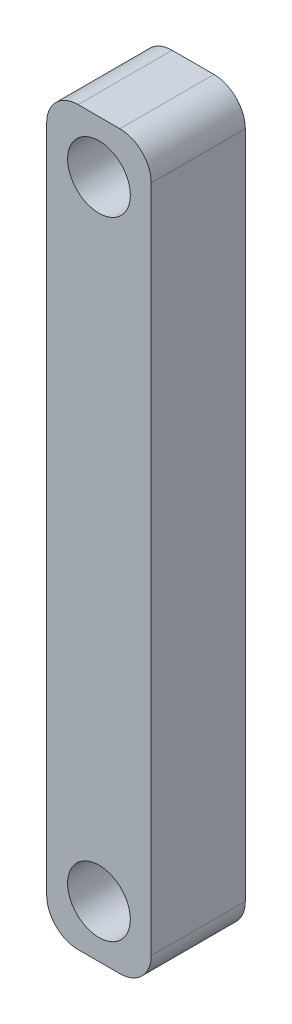
ISO-10303-21;
HEADER;
FILE_DESCRIPTION(('STEP AP214'),'2;1');
FILE_NAME('part.step','',(''),(''),'','','');
FILE_SCHEMA(('AUTOMOTIVE_DESIGN { 1 0 10303 214 1 1 1 1 }'));
ENDSEC;
DATA;
#1=APPLICATION_CONTEXT('core data for automotive mechanical design processes');
#2=APPLICATION_PROTOCOL_DEFINITION('international standard','automotive_design',2000,#1);
#3=PRODUCT_CONTEXT('',#1,'mechanical');
#4=PRODUCT('Part','Part','',(#3));
#5=PRODUCT_RELATED_PRODUCT_CATEGORY('part','',(#4));
#6=PRODUCT_DEFINITION_FORMATION('','',#4);
#7=PRODUCT_DEFINITION_CONTEXT('part definition',#1,'design');
#8=PRODUCT_DEFINITION('design','',#6,#7);
#9=PRODUCT_DEFINITION_SHAPE('','',#8);
#10=(LENGTH_UNIT() NAMED_UNIT(*) SI_UNIT(.MILLI.,.METRE.));
#11=(NAMED_UNIT(*) PLANE_ANGLE_UNIT() SI_UNIT($,.RADIAN.));
#12=(NAMED_UNIT(*) SI_UNIT($,.STERADIAN.) SOLID_ANGLE_UNIT());
#13=UNCERTAINTY_MEASURE_WITH_UNIT(LENGTH_MEASURE(1.E-05),#10,'distance_accuracy_value','');
#14=(GEOMETRIC_REPRESENTATION_CONTEXT(3) GLOBAL_UNCERTAINTY_ASSIGNED_CONTEXT((#13)) GLOBAL_UNIT_ASSIGNED_CONTEXT((#10,
#11,#12)) REPRESENTATION_CONTEXT('',''));
#15=CARTESIAN_POINT('',(0.,0.,0.));
#16=DIRECTION('',(0.,0.,1.));
#17=DIRECTION('',(1.,0.,0.));
#18=AXIS2_PLACEMENT_3D('',#15,#16,#17);
#19=CARTESIAN_POINT('',(-20.5496626180832,69.7557354925773,22.86));
#20=DIRECTION('',(1.,0.,0.));
#21=DIRECTION('',(0.,0.,-0.999999999999999));
#22=AXIS2_PLACEMENT_3D('',#19,#20,#21);
#23=PLANE('',#22);
#24=DIRECTION('',(0.,-1.,0.));
#25=VECTOR('',#24,1.);
#26=CARTESIAN_POINT('',(-20.5496626180832,69.7557354925773,22.86));
#27=LINE('',#26,#25);
#28=CARTESIAN_POINT('',(-20.5496626180836,62.1357354925776,22.86));
#29=VERTEX_POINT('',#28);
#30=CARTESIAN_POINT('',(-20.5496626180834,-100.424264507422,22.86));
#31=VERTEX_POINT('',#30);
#32=EDGE_CURVE('E118',#29,#31,#27,.T.);
#33=ORIENTED_EDGE('',*,*,#32,.F.);
#34=DIRECTION('',(0.,0.,-0.999999999999999));
#35=VECTOR('',#34,1.);
#36=CARTESIAN_POINT('',(-20.5496626180836,62.1357354925776,22.86));
#37=LINE('',#36,#35);
#38=CARTESIAN_POINT('',(-20.5496626180836,62.1357354925776,0.));
#39=VERTEX_POINT('',#38);
#40=EDGE_CURVE('E103',#29,#39,#37,.T.);
#41=ORIENTED_EDGE('',*,*,#40,.T.);
#42=DIRECTION('',(0.,-1.,0.));
#43=VECTOR('',#42,1.);
#44=CARTESIAN_POINT('',(-20.5496626180832,69.7557354925773,0.));
#45=LINE('',#44,#43);
#46=CARTESIAN_POINT('',(-20.5496626180831,-100.424264507423,0.));
#47=VERTEX_POINT('',#46);
#48=EDGE_CURVE('E115',#39,#47,#45,.T.);
#49=ORIENTED_EDGE('',*,*,#48,.T.);
#50=DIRECTION('',(0.,0.,-0.999999999999999));
#51=VECTOR('',#50,1.);
#52=CARTESIAN_POINT('',(-20.5496626180834,-100.424264507422,22.86));
#53=LINE('',#52,#51);
#54=EDGE_CURVE('E120',#47,#31,#53,.F.);
#55=ORIENTED_EDGE('',*,*,#54,.T.);
#56=EDGE_LOOP('',(#33,#41,#49,#55));
#57=FACE_BOUND('',#56,.T.);
#58=ADVANCED_FACE('F32',(#57),#23,.F.);
#59=CARTESIAN_POINT('',(-20.5496626180834,-108.044264507422,22.86));
#60=DIRECTION('',(0.,1.,0.));
#61=DIRECTION('',(0.,0.,0.999999999999999));
#62=AXIS2_PLACEMENT_3D('',#59,#60,#61);
#63=PLANE('',#62);
#64=DIRECTION('',(1.,0.,0.));
#65=VECTOR('',#64,1.);
#66=CARTESIAN_POINT('',(-20.5496626180834,-108.044264507422,22.86));
#67=LINE('',#66,#65);
#68=CARTESIAN_POINT('',(-12.9296626180835,-108.044264507422,22.86));
#69=VERTEX_POINT('',#68);
#70=CARTESIAN_POINT('',(-2.76966261808331,-108.044264507422,22.86));
#71=VERTEX_POINT('',#70);
#72=EDGE_CURVE('E166',#69,#71,#67,.T.);
#73=ORIENTED_EDGE('',*,*,#72,.F.);
#74=DIRECTION('',(0.,0.,-0.999999999999999));
#75=VECTOR('',#74,1.);
#76=CARTESIAN_POINT('',(-12.9296626180835,-108.044264507422,22.86));
#77=LINE('',#76,#75);
#78=CARTESIAN_POINT('',(-12.9296626180835,-108.044264507422,0.));
#79=VERTEX_POINT('',#78);
#80=EDGE_CURVE('E11',#69,#79,#77,.T.);
#81=ORIENTED_EDGE('',*,*,#80,.T.);
#82=DIRECTION('',(1.,0.,0.));
#83=VECTOR('',#82,1.);
#84=CARTESIAN_POINT('',(-20.5496626180834,-108.044264507422,0.));
#85=LINE('',#84,#83);
#86=CARTESIAN_POINT('',(-2.76966261808331,-108.044264507422,0.));
#87=VERTEX_POINT('',#86);
#88=EDGE_CURVE('E125',#79,#87,#85,.T.);
#89=ORIENTED_EDGE('',*,*,#88,.T.);
#90=DIRECTION('',(0.,0.,-0.999999999999999));
#91=VECTOR('',#90,1.);
#92=CARTESIAN_POINT('',(-2.76966261808331,-108.044264507422,22.86));
#93=LINE('',#92,#91);
#94=EDGE_CURVE('E40',#87,#71,#93,.F.);
#95=ORIENTED_EDGE('',*,*,#94,.T.);
#96=EDGE_LOOP('',(#73,#81,#89,#95));
#97=FACE_BOUND('',#96,.T.);
#98=ADVANCED_FACE('F165',(#97),#63,.F.);
#99=CARTESIAN_POINT('',(4.85033738191665,69.7557354925771,22.86));
#100=DIRECTION('',(-1.,0.,0.));
#101=DIRECTION('',(0.,-1.,0.));
#102=AXIS2_PLACEMENT_3D('',#99,#100,#101);
#103=PLANE('',#102);
#104=DIRECTION('',(0.,1.,0.));
#105=VECTOR('',#104,1.);
#106=CARTESIAN_POINT('',(4.85033738191665,69.7557354925771,0.));
#107=LINE('',#106,#105);
#108=CARTESIAN_POINT('',(4.85033738191643,-100.424264507422,0.));
#109=VERTEX_POINT('',#108);
#110=CARTESIAN_POINT('',(4.85033738191643,62.1357354925776,0.));
#111=VERTEX_POINT('',#110);
#112=EDGE_CURVE('E129',#109,#111,#107,.T.);
#113=ORIENTED_EDGE('',*,*,#112,.T.);
#114=DIRECTION('',(0.,0.,-0.999999999999999));
#115=VECTOR('',#114,1.);
#116=CARTESIAN_POINT('',(4.85033738191643,62.1357354925776,22.86));
#117=LINE('',#116,#115);
#118=CARTESIAN_POINT('',(4.85033738191643,62.1357354925776,22.86));
#119=VERTEX_POINT('',#118);
#120=EDGE_CURVE('E47',#111,#119,#117,.F.);
#121=ORIENTED_EDGE('',*,*,#120,.T.);
#122=DIRECTION('',(0.,1.,0.));
#123=VECTOR('',#122,1.);
#124=CARTESIAN_POINT('',(4.85033738191665,69.7557354925771,22.86));
#125=LINE('',#124,#123);
#126=CARTESIAN_POINT('',(4.85033738191643,-100.424264507422,22.86));
#127=VERTEX_POINT('',#126);
#128=EDGE_CURVE('E172',#127,#119,#125,.T.);
#129=ORIENTED_EDGE('',*,*,#128,.F.);
#130=DIRECTION('',(0.,0.,-0.999999999999999));
#131=VECTOR('',#130,1.);
#132=CARTESIAN_POINT('',(4.85033738191643,-100.424264507422,22.86));
#133=LINE('',#132,#131);
#134=EDGE_CURVE('E159',#127,#109,#133,.T.);
#135=ORIENTED_EDGE('',*,*,#134,.T.);
#136=EDGE_LOOP('',(#113,#121,#129,#135));
#137=FACE_BOUND('',#136,.T.);
#138=ADVANCED_FACE('F176',(#137),#103,.F.);
#139=CARTESIAN_POINT('',(-20.5496626180832,69.7557354925773,22.86));
#140=DIRECTION('',(0.,-1.,0.));
#141=DIRECTION('',(0.,0.,-0.999999999999999));
#142=AXIS2_PLACEMENT_3D('',#139,#140,#141);
#143=PLANE('',#142);
#144=DIRECTION('',(-1.,0.,0.));
#145=VECTOR('',#144,1.);
#146=CARTESIAN_POINT('',(-20.5496626180832,69.7557354925773,0.));
#147=LINE('',#146,#145);
#148=CARTESIAN_POINT('',(-2.76966261808353,69.7557354925774,0.));
#149=VERTEX_POINT('',#148);
#150=CARTESIAN_POINT('',(-12.9296626180835,69.7557354925773,0.));
#151=VERTEX_POINT('',#150);
#152=EDGE_CURVE('E139',#149,#151,#147,.T.);
#153=ORIENTED_EDGE('',*,*,#152,.T.);
#154=DIRECTION('',(0.,0.,-0.999999999999999));
#155=VECTOR('',#154,1.);
#156=CARTESIAN_POINT('',(-12.9296626180835,69.7557354925773,22.86));
#157=LINE('',#156,#155);
#158=CARTESIAN_POINT('',(-12.9296626180835,69.7557354925773,22.86));
#159=VERTEX_POINT('',#158);
#160=EDGE_CURVE('E104',#151,#159,#157,.F.);
#161=ORIENTED_EDGE('',*,*,#160,.T.);
#162=DIRECTION('',(-1.,0.,0.));
#163=VECTOR('',#162,1.);
#164=CARTESIAN_POINT('',(-20.5496626180832,69.7557354925773,22.86));
#165=LINE('',#164,#163);
#166=CARTESIAN_POINT('',(-2.76966261808353,69.7557354925774,22.86));
#167=VERTEX_POINT('',#166);
#168=EDGE_CURVE('E135',#167,#159,#165,.T.);
#169=ORIENTED_EDGE('',*,*,#168,.F.);
#170=DIRECTION('',(0.,0.,-0.999999999999999));
#171=VECTOR('',#170,1.);
#172=CARTESIAN_POINT('',(-2.76966261808353,69.7557354925774,22.86));
#173=LINE('',#172,#171);
#174=EDGE_CURVE('E109',#167,#149,#173,.T.);
#175=ORIENTED_EDGE('',*,*,#174,.T.);
#176=EDGE_LOOP('',(#153,#161,#169,#175));
#177=FACE_BOUND('',#176,.T.);
#178=ADVANCED_FACE('F183',(#177),#143,.F.);
#179=CARTESIAN_POINT('',(-20.5496626180834,-108.044264507422,22.86));
#180=DIRECTION('',(0.,0.,0.999999999999999));
#181=DIRECTION('',(1.,0.,0.));
#182=AXIS2_PLACEMENT_3D('',#179,#180,#181);
#183=PLANE('',#182);
#184=CARTESIAN_POINT('',(-7.84966261808362,57.0557354925775,22.86));
#185=DIRECTION('',(0.,0.,0.999999999999999));
#186=DIRECTION('',(1.,0.,0.));
#187=AXIS2_PLACEMENT_3D('',#184,#185,#186);
#188=CIRCLE('',#187,7.62);
#189=CARTESIAN_POINT('',(-0.229662618083513,57.0557354925774,22.86));
#190=VERTEX_POINT('',#189);
#191=EDGE_CURVE('E144',#190,#190,#188,.T.);
#192=ORIENTED_EDGE('',*,*,#191,.F.);
#193=EDGE_LOOP('',(#192));
#194=FACE_BOUND('',#193,.T.);
#195=CARTESIAN_POINT('',(-7.84966261808329,-95.3442645074225,22.86));
#196=DIRECTION('',(0.,0.,0.999999999999999));
#197=DIRECTION('',(1.,0.,0.));
#198=AXIS2_PLACEMENT_3D('',#195,#196,#197);
#199=CIRCLE('',#198,7.62);
#200=CARTESIAN_POINT('',(-0.229662618083291,-95.3442645074225,22.86));
#201=VERTEX_POINT('',#200);
#202=EDGE_CURVE('E132',#201,#201,#199,.T.);
#203=ORIENTED_EDGE('',*,*,#202,.F.);
#204=EDGE_LOOP('',(#203));
#205=FACE_BOUND('',#204,.T.);
#206=ORIENTED_EDGE('',*,*,#168,.T.);
#207=CARTESIAN_POINT('',(-12.9296626180836,62.1357354925774,22.86));
#208=DIRECTION('',(0.,0.,0.999999999999999));
#209=DIRECTION('',(1.,0.,0.));
#210=AXIS2_PLACEMENT_3D('',#207,#208,#209);
#211=CIRCLE('',#210,7.62);
#212=EDGE_CURVE('E157',#159,#29,#211,.T.);
#213=ORIENTED_EDGE('',*,*,#212,.T.);
#214=ORIENTED_EDGE('',*,*,#32,.T.);
#215=CARTESIAN_POINT('',(-12.9296626180835,-100.424264507422,22.86));
#216=DIRECTION('',(0.,0.,0.999999999999999));
#217=DIRECTION('',(1.,0.,0.));
#218=AXIS2_PLACEMENT_3D('',#215,#216,#217);
#219=CIRCLE('',#218,7.62);
#220=EDGE_CURVE('E153',#31,#69,#219,.T.);
#221=ORIENTED_EDGE('',*,*,#220,.T.);
#222=ORIENTED_EDGE('',*,*,#72,.T.);
#223=CARTESIAN_POINT('',(-2.76966261808331,-100.424264507422,22.86));
#224=DIRECTION('',(0.,0.,0.999999999999999));
#225=DIRECTION('',(1.,0.,0.));
#226=AXIS2_PLACEMENT_3D('',#223,#224,#225);
#227=CIRCLE('',#226,7.62);
#228=EDGE_CURVE('E54',#71,#127,#227,.T.);
#229=ORIENTED_EDGE('',*,*,#228,.T.);
#230=ORIENTED_EDGE('',*,*,#128,.T.);
#231=CARTESIAN_POINT('',(-2.76966261808331,62.1357354925772,22.86));
#232=DIRECTION('',(0.,0.,0.999999999999999));
#233=DIRECTION('',(1.,0.,0.));
#234=AXIS2_PLACEMENT_3D('',#231,#232,#233);
#235=CIRCLE('',#234,7.62);
#236=EDGE_CURVE('E155',#119,#167,#235,.T.);
#237=ORIENTED_EDGE('',*,*,#236,.T.);
#238=EDGE_LOOP('',(#206,#213,#214,#221,#222,#229,#230,#237));
#239=FACE_BOUND('',#238,.T.);
#240=ADVANCED_FACE('F170',(#194,#205,#239),#183,.T.);
#241=CARTESIAN_POINT('',(-20.5496626180834,-108.044264507422,0.));
#242=DIRECTION('',(0.,0.,0.999999999999999));
#243=DIRECTION('',(1.,0.,0.));
#244=AXIS2_PLACEMENT_3D('',#241,#242,#243);
#245=PLANE('',#244);
#246=CARTESIAN_POINT('',(-7.84966261808362,57.0557354925775,0.));
#247=DIRECTION('',(0.,0.,0.999999999999999));
#248=DIRECTION('',(1.,0.,0.));
#249=AXIS2_PLACEMENT_3D('',#246,#247,#248);
#250=CIRCLE('',#249,7.62);
#251=CARTESIAN_POINT('',(-0.229662618083513,57.0557354925774,0.));
#252=VERTEX_POINT('',#251);
#253=EDGE_CURVE('E141',#252,#252,#250,.T.);
#254=ORIENTED_EDGE('',*,*,#253,.T.);
#255=EDGE_LOOP('',(#254));
#256=FACE_BOUND('',#255,.T.);
#257=CARTESIAN_POINT('',(-7.84966261808329,-95.3442645074225,0.));
#258=DIRECTION('',(0.,0.,0.999999999999999));
#259=DIRECTION('',(1.,0.,0.));
#260=AXIS2_PLACEMENT_3D('',#257,#258,#259);
#261=CIRCLE('',#260,7.62);
#262=CARTESIAN_POINT('',(-0.229662618083291,-95.3442645074225,0.));
#263=VERTEX_POINT('',#262);
#264=EDGE_CURVE('E126',#263,#263,#261,.T.);
#265=ORIENTED_EDGE('',*,*,#264,.T.);
#266=EDGE_LOOP('',(#265));
#267=FACE_BOUND('',#266,.T.);
#268=ORIENTED_EDGE('',*,*,#48,.F.);
#269=CARTESIAN_POINT('',(-12.9296626180836,62.1357354925774,0.));
#270=DIRECTION('',(0.,0.,0.999999999999999));
#271=DIRECTION('',(1.,0.,0.));
#272=AXIS2_PLACEMENT_3D('',#269,#270,#271);
#273=CIRCLE('',#272,7.62);
#274=EDGE_CURVE('E99',#39,#151,#273,.F.);
#275=ORIENTED_EDGE('',*,*,#274,.T.);
#276=ORIENTED_EDGE('',*,*,#152,.F.);
#277=CARTESIAN_POINT('',(-2.76966261808331,62.1357354925772,0.));
#278=DIRECTION('',(0.,0.,0.999999999999999));
#279=DIRECTION('',(1.,0.,0.));
#280=AXIS2_PLACEMENT_3D('',#277,#278,#279);
#281=CIRCLE('',#280,7.62);
#282=EDGE_CURVE('E110',#149,#111,#281,.F.);
#283=ORIENTED_EDGE('',*,*,#282,.T.);
#284=ORIENTED_EDGE('',*,*,#112,.F.);
#285=CARTESIAN_POINT('',(-2.76966261808331,-100.424264507422,0.));
#286=DIRECTION('',(0.,0.,0.999999999999999));
#287=DIRECTION('',(1.,0.,0.));
#288=AXIS2_PLACEMENT_3D('',#285,#286,#287);
#289=CIRCLE('',#288,7.62);
#290=EDGE_CURVE('E119',#109,#87,#289,.F.);
#291=ORIENTED_EDGE('',*,*,#290,.T.);
#292=ORIENTED_EDGE('',*,*,#88,.F.);
#293=CARTESIAN_POINT('',(-12.9296626180835,-100.424264507422,0.));
#294=DIRECTION('',(0.,0.,0.999999999999999));
#295=DIRECTION('',(1.,0.,0.));
#296=AXIS2_PLACEMENT_3D('',#293,#294,#295);
#297=CIRCLE('',#296,7.62);
#298=EDGE_CURVE('E124',#79,#47,#297,.F.);
#299=ORIENTED_EDGE('',*,*,#298,.T.);
#300=EDGE_LOOP('',(#268,#275,#276,#283,#284,#291,#292,#299));
#301=FACE_BOUND('',#300,.T.);
#302=ADVANCED_FACE('F122',(#256,#267,#301),#245,.F.);
#303=CARTESIAN_POINT('',(-7.84966261808329,-95.3442645074225,-55.8799999999999));
#304=DIRECTION('',(0.,0.,0.999999999999999));
#305=DIRECTION('',(1.,0.,0.));
#306=AXIS2_PLACEMENT_3D('',#303,#304,#305);
#307=CYLINDRICAL_SURFACE('',#306,7.62);
#308=CARTESIAN_POINT('',(-0.229662618083291,-95.3442645074225,22.86));
#309=CARTESIAN_POINT('',(-0.229662618083291,-95.3442645074225,22.621875));
#310=CARTESIAN_POINT('',(-0.229662618083291,-95.3442645074225,22.38375));
#311=CARTESIAN_POINT('',(-0.229662618083291,-95.3442645074225,21.9075));
#312=CARTESIAN_POINT('',(-0.229662618083291,-95.3442645074225,21.669375));
#313=CARTESIAN_POINT('',(-0.229662618083291,-95.3442645074225,21.193125));
#314=CARTESIAN_POINT('',(-0.229662618083291,-95.3442645074225,20.955));
#315=CARTESIAN_POINT('',(-0.229662618083291,-95.3442645074225,20.47875));
#316=CARTESIAN_POINT('',(-0.229662618083291,-95.3442645074225,20.240625));
#317=CARTESIAN_POINT('',(-0.229662618083291,-95.3442645074225,19.764375));
#318=CARTESIAN_POINT('',(-0.229662618083291,-95.3442645074225,19.52625));
#319=CARTESIAN_POINT('',(-0.229662618083291,-95.3442645074225,19.05));
#320=CARTESIAN_POINT('',(-0.229662618083291,-95.3442645074225,18.811875));
#321=CARTESIAN_POINT('',(-0.229662618083291,-95.3442645074225,18.335625));
#322=CARTESIAN_POINT('',(-0.229662618083291,-95.3442645074225,18.0975));
#323=CARTESIAN_POINT('',(-0.229662618083291,-95.3442645074225,17.62125));
#324=CARTESIAN_POINT('',(-0.229662618083291,-95.3442645074225,17.383125));
#325=CARTESIAN_POINT('',(-0.229662618083291,-95.3442645074225,16.906875));
#326=CARTESIAN_POINT('',(-0.229662618083291,-95.3442645074225,16.66875));
#327=CARTESIAN_POINT('',(-0.229662618083291,-95.3442645074225,16.1925));
#328=CARTESIAN_POINT('',(-0.229662618083291,-95.3442645074225,15.954375));
#329=CARTESIAN_POINT('',(-0.229662618083291,-95.3442645074225,15.478125));
#330=CARTESIAN_POINT('',(-0.229662618083291,-95.3442645074225,15.24));
#331=CARTESIAN_POINT('',(-0.229662618083291,-95.3442645074225,14.76375));
#332=CARTESIAN_POINT('',(-0.229662618083291,-95.3442645074225,14.525625));
#333=CARTESIAN_POINT('',(-0.229662618083291,-95.3442645074225,14.049375));
#334=CARTESIAN_POINT('',(-0.229662618083291,-95.3442645074225,13.81125));
#335=CARTESIAN_POINT('',(-0.229662618083291,-95.3442645074225,13.335));
#336=CARTESIAN_POINT('',(-0.229662618083291,-95.3442645074225,13.096875));
#337=CARTESIAN_POINT('',(-0.229662618083291,-95.3442645074225,12.620625));
#338=CARTESIAN_POINT('',(-0.229662618083291,-95.3442645074225,12.3825));
#339=CARTESIAN_POINT('',(-0.229662618083291,-95.3442645074225,11.90625));
#340=CARTESIAN_POINT('',(-0.229662618083291,-95.3442645074225,11.668125));
#341=CARTESIAN_POINT('',(-0.229662618083291,-95.3442645074225,11.191875));
#342=CARTESIAN_POINT('',(-0.229662618083291,-95.3442645074225,10.95375));
#343=CARTESIAN_POINT('',(-0.229662618083291,-95.3442645074225,10.4775));
#344=CARTESIAN_POINT('',(-0.229662618083291,-95.3442645074225,10.239375));
#345=CARTESIAN_POINT('',(-0.229662618083291,-95.3442645074225,9.76312499999999));
#346=CARTESIAN_POINT('',(-0.229662618083291,-95.3442645074225,9.52499999999999));
#347=CARTESIAN_POINT('',(-0.229662618083291,-95.3442645074225,9.04874999999999));
#348=CARTESIAN_POINT('',(-0.229662618083291,-95.3442645074225,8.81062499999998));
#349=CARTESIAN_POINT('',(-0.229662618083291,-95.3442645074225,8.33437499999999));
#350=CARTESIAN_POINT('',(-0.229662618083291,-95.3442645074225,8.09624999999999));
#351=CARTESIAN_POINT('',(-0.229662618083291,-95.3442645074225,7.61999999999999));
#352=CARTESIAN_POINT('',(-0.229662618083291,-95.3442645074225,7.38187499999999));
#353=CARTESIAN_POINT('',(-0.229662618083291,-95.3442645074225,6.90562499999999));
#354=CARTESIAN_POINT('',(-0.229662618083291,-95.3442645074225,6.66749999999999));
#355=CARTESIAN_POINT('',(-0.229662618083291,-95.3442645074225,6.19124999999999));
#356=CARTESIAN_POINT('',(-0.229662618083291,-95.3442645074225,5.95312499999998));
#357=CARTESIAN_POINT('',(-0.229662618083291,-95.3442645074225,5.47687499999998));
#358=CARTESIAN_POINT('',(-0.229662618083291,-95.3442645074225,5.23874999999998));
#359=CARTESIAN_POINT('',(-0.229662618083291,-95.3442645074225,4.76249999999998));
#360=CARTESIAN_POINT('',(-0.229662618083291,-95.3442645074225,4.52437499999998));
#361=CARTESIAN_POINT('',(-0.229662618083291,-95.3442645074225,4.04812499999998));
#362=CARTESIAN_POINT('',(-0.229662618083291,-95.3442645074225,3.80999999999998));
#363=CARTESIAN_POINT('',(-0.229662618083291,-95.3442645074225,3.33374999999999));
#364=CARTESIAN_POINT('',(-0.229662618083291,-95.3442645074225,3.09562499999999));
#365=CARTESIAN_POINT('',(-0.229662618083291,-95.3442645074225,2.61937499999998));
#366=CARTESIAN_POINT('',(-0.229662618083291,-95.3442645074225,2.38124999999998));
#367=CARTESIAN_POINT('',(-0.229662618083291,-95.3442645074225,1.90499999999998));
#368=CARTESIAN_POINT('',(-0.229662618083291,-95.3442645074225,1.66687499999998));
#369=CARTESIAN_POINT('',(-0.229662618083291,-95.3442645074225,1.19062499999998));
#370=CARTESIAN_POINT('',(-0.229662618083291,-95.3442645074225,0.952499999999983));
#371=CARTESIAN_POINT('',(-0.229662618083291,-95.3442645074225,0.476249999999981));
#372=CARTESIAN_POINT('',(-0.229662618083291,-95.3442645074225,0.23812499999998));
#373=CARTESIAN_POINT('',(-0.229662618083291,-95.3442645074225,0.));
#374=B_SPLINE_CURVE_WITH_KNOTS('',3,(#308,#309,#310,#311,#312,#313,#314,#315,#316,#317,#318,
#319,#320,#321,#322,#323,#324,#325,#326,#327,#328,#329,#330,#331,#332,#333,#334,#335,#336,#337,
#338,#339,#340,#341,#342,#343,#344,#345,#346,#347,#348,#349,#350,#351,#352,#353,#354,#355,#356,
#357,#358,#359,#360,#361,#362,#363,#364,#365,#366,#367,#368,#369,#370,#371,#372,#373),
.UNSPECIFIED.,.F.,.F.,(4,2,2,2,2,2,2,2,2,2,2,2,2,2,2,2,2,2,2,2,2,2,2,2,2,2,2,2,2,2,2,2,4),(0.,
0.714374999999989,1.42874999999999,2.143125,2.8575,3.57187499999999,4.28624999999999,
5.00062499999999,5.715,6.429375,7.14375,7.85812500000001,8.5725,9.286875,10.00125,10.715625,
11.43,12.144375,12.85875,13.573125,14.2875,15.001875,15.71625,16.430625,17.145,17.859375,
18.57375,19.288125,20.0025,20.716875,21.43125,22.145625,22.86),.UNSPECIFIED.);
#375=EDGE_CURVE('BSEAM199',#201,#263,#374,.T.);
#376=ORIENTED_EDGE('',*,*,#202,.T.);
#377=ORIENTED_EDGE('',*,*,#264,.F.);
#378=ORIENTED_EDGE('',*,*,#375,.T.);
#379=ORIENTED_EDGE('',*,*,#375,.F.);
#380=EDGE_LOOP('',(#376,#378,#377,#379));
#381=FACE_BOUND('',#380,.T.);
#382=ADVANCED_FACE('F199',(#381),#307,.F.);
#383=CARTESIAN_POINT('',(-7.84966261808351,57.0557354925774,-55.8799999999999));
#384=DIRECTION('',(0.,0.,0.999999999999999));
#385=DIRECTION('',(1.,0.,0.));
#386=AXIS2_PLACEMENT_3D('',#383,#384,#385);
#387=CYLINDRICAL_SURFACE('',#386,7.62);
#388=CARTESIAN_POINT('',(-0.229662618083513,57.0557354925774,22.86));
#389=CARTESIAN_POINT('',(-0.229662618083513,57.0557354925774,22.621875));
#390=CARTESIAN_POINT('',(-0.229662618083513,57.0557354925774,22.38375));
#391=CARTESIAN_POINT('',(-0.229662618083513,57.0557354925774,21.9075));
#392=CARTESIAN_POINT('',(-0.229662618083513,57.0557354925774,21.669375));
#393=CARTESIAN_POINT('',(-0.229662618083513,57.0557354925774,21.193125));
#394=CARTESIAN_POINT('',(-0.229662618083513,57.0557354925774,20.955));
#395=CARTESIAN_POINT('',(-0.229662618083513,57.0557354925774,20.47875));
#396=CARTESIAN_POINT('',(-0.229662618083513,57.0557354925774,20.240625));
#397=CARTESIAN_POINT('',(-0.229662618083513,57.0557354925774,19.764375));
#398=CARTESIAN_POINT('',(-0.229662618083513,57.0557354925774,19.52625));
#399=CARTESIAN_POINT('',(-0.229662618083513,57.0557354925774,19.05));
#400=CARTESIAN_POINT('',(-0.229662618083513,57.0557354925774,18.811875));
#401=CARTESIAN_POINT('',(-0.229662618083513,57.0557354925774,18.335625));
#402=CARTESIAN_POINT('',(-0.229662618083513,57.0557354925774,18.0975));
#403=CARTESIAN_POINT('',(-0.229662618083513,57.0557354925774,17.62125));
#404=CARTESIAN_POINT('',(-0.229662618083513,57.0557354925774,17.383125));
#405=CARTESIAN_POINT('',(-0.229662618083513,57.0557354925774,16.906875));
#406=CARTESIAN_POINT('',(-0.229662618083513,57.0557354925774,16.66875));
#407=CARTESIAN_POINT('',(-0.229662618083513,57.0557354925774,16.1925));
#408=CARTESIAN_POINT('',(-0.229662618083513,57.0557354925774,15.954375));
#409=CARTESIAN_POINT('',(-0.229662618083513,57.0557354925774,15.478125));
#410=CARTESIAN_POINT('',(-0.229662618083513,57.0557354925774,15.24));
#411=CARTESIAN_POINT('',(-0.229662618083513,57.0557354925774,14.76375));
#412=CARTESIAN_POINT('',(-0.229662618083513,57.0557354925774,14.525625));
#413=CARTESIAN_POINT('',(-0.229662618083513,57.0557354925774,14.049375));
#414=CARTESIAN_POINT('',(-0.229662618083513,57.0557354925774,13.81125));
#415=CARTESIAN_POINT('',(-0.229662618083513,57.0557354925774,13.335));
#416=CARTESIAN_POINT('',(-0.229662618083513,57.0557354925774,13.096875));
#417=CARTESIAN_POINT('',(-0.229662618083513,57.0557354925774,12.620625));
#418=CARTESIAN_POINT('',(-0.229662618083513,57.0557354925774,12.3825));
#419=CARTESIAN_POINT('',(-0.229662618083513,57.0557354925774,11.90625));
#420=CARTESIAN_POINT('',(-0.229662618083513,57.0557354925774,11.668125));
#421=CARTESIAN_POINT('',(-0.229662618083513,57.0557354925774,11.191875));
#422=CARTESIAN_POINT('',(-0.229662618083513,57.0557354925774,10.95375));
#423=CARTESIAN_POINT('',(-0.229662618083513,57.0557354925774,10.4775));
#424=CARTESIAN_POINT('',(-0.229662618083513,57.0557354925774,10.239375));
#425=CARTESIAN_POINT('',(-0.229662618083513,57.0557354925774,9.76312499999999));
#426=CARTESIAN_POINT('',(-0.229662618083513,57.0557354925774,9.52499999999999));
#427=CARTESIAN_POINT('',(-0.229662618083513,57.0557354925774,9.04874999999999));
#428=CARTESIAN_POINT('',(-0.229662618083513,57.0557354925774,8.81062499999998));
#429=CARTESIAN_POINT('',(-0.229662618083513,57.0557354925774,8.33437499999999));
#430=CARTESIAN_POINT('',(-0.229662618083513,57.0557354925774,8.09624999999999));
#431=CARTESIAN_POINT('',(-0.229662618083513,57.0557354925774,7.61999999999999));
#432=CARTESIAN_POINT('',(-0.229662618083513,57.0557354925774,7.38187499999999));
#433=CARTESIAN_POINT('',(-0.229662618083513,57.0557354925774,6.90562499999999));
#434=CARTESIAN_POINT('',(-0.229662618083513,57.0557354925774,6.66749999999999));
#435=CARTESIAN_POINT('',(-0.229662618083513,57.0557354925774,6.19124999999999));
#436=CARTESIAN_POINT('',(-0.229662618083513,57.0557354925774,5.95312499999998));
#437=CARTESIAN_POINT('',(-0.229662618083513,57.0557354925774,5.47687499999998));
#438=CARTESIAN_POINT('',(-0.229662618083513,57.0557354925774,5.23874999999998));
#439=CARTESIAN_POINT('',(-0.229662618083513,57.0557354925774,4.76249999999998));
#440=CARTESIAN_POINT('',(-0.229662618083513,57.0557354925774,4.52437499999998));
#441=CARTESIAN_POINT('',(-0.229662618083513,57.0557354925774,4.04812499999998));
#442=CARTESIAN_POINT('',(-0.229662618083513,57.0557354925774,3.80999999999998));
#443=CARTESIAN_POINT('',(-0.229662618083513,57.0557354925774,3.33374999999999));
#444=CARTESIAN_POINT('',(-0.229662618083513,57.0557354925774,3.09562499999999));
#445=CARTESIAN_POINT('',(-0.229662618083513,57.0557354925774,2.61937499999998));
#446=CARTESIAN_POINT('',(-0.229662618083513,57.0557354925774,2.38124999999998));
#447=CARTESIAN_POINT('',(-0.229662618083513,57.0557354925774,1.90499999999998));
#448=CARTESIAN_POINT('',(-0.229662618083513,57.0557354925774,1.66687499999998));
#449=CARTESIAN_POINT('',(-0.229662618083513,57.0557354925774,1.19062499999998));
#450=CARTESIAN_POINT('',(-0.229662618083513,57.0557354925774,0.952499999999983));
#451=CARTESIAN_POINT('',(-0.229662618083513,57.0557354925774,0.476249999999981));
#452=CARTESIAN_POINT('',(-0.229662618083513,57.0557354925774,0.23812499999998));
#453=CARTESIAN_POINT('',(-0.229662618083513,57.0557354925774,0.));
#454=B_SPLINE_CURVE_WITH_KNOTS('',3,(#388,#389,#390,#391,#392,#393,#394,#395,#396,#397,#398,
#399,#400,#401,#402,#403,#404,#405,#406,#407,#408,#409,#410,#411,#412,#413,#414,#415,#416,#417,
#418,#419,#420,#421,#422,#423,#424,#425,#426,#427,#428,#429,#430,#431,#432,#433,#434,#435,#436,
#437,#438,#439,#440,#441,#442,#443,#444,#445,#446,#447,#448,#449,#450,#451,#452,#453),
.UNSPECIFIED.,.F.,.F.,(4,2,2,2,2,2,2,2,2,2,2,2,2,2,2,2,2,2,2,2,2,2,2,2,2,2,2,2,2,2,2,2,4),(0.,
0.714374999999989,1.42874999999999,2.143125,2.8575,3.57187499999999,4.28624999999999,
5.00062499999999,5.715,6.429375,7.14375,7.85812500000001,8.5725,9.286875,10.00125,10.715625,
11.43,12.144375,12.85875,13.573125,14.2875,15.001875,15.71625,16.430625,17.145,17.859375,
18.57375,19.288125,20.0025,20.716875,21.43125,22.145625,22.86),.UNSPECIFIED.);
#455=EDGE_CURVE('BSEAM191',#190,#252,#454,.T.);
#456=ORIENTED_EDGE('',*,*,#191,.T.);
#457=ORIENTED_EDGE('',*,*,#253,.F.);
#458=ORIENTED_EDGE('',*,*,#455,.T.);
#459=ORIENTED_EDGE('',*,*,#455,.F.);
#460=EDGE_LOOP('',(#456,#458,#457,#459));
#461=FACE_BOUND('',#460,.T.);
#462=ADVANCED_FACE('F191',(#461),#387,.F.);
#463=CARTESIAN_POINT('',(-12.9296626180836,62.1357354925774,22.86));
#464=DIRECTION('',(0.,0.,-0.999999999999999));
#465=DIRECTION('',(-1.,0.,0.));
#466=AXIS2_PLACEMENT_3D('',#463,#464,#465);
#467=CYLINDRICAL_SURFACE('',#466,7.62);
#468=ORIENTED_EDGE('',*,*,#212,.F.);
#469=ORIENTED_EDGE('',*,*,#160,.F.);
#470=ORIENTED_EDGE('',*,*,#274,.F.);
#471=ORIENTED_EDGE('',*,*,#40,.F.);
#472=EDGE_LOOP('',(#468,#469,#470,#471));
#473=FACE_BOUND('',#472,.T.);
#474=ADVANCED_FACE('F102',(#473),#467,.T.);
#475=CARTESIAN_POINT('',(-2.76966261808331,62.1357354925772,22.86));
#476=DIRECTION('',(0.,0.,-0.999999999999999));
#477=DIRECTION('',(-1.,0.,0.));
#478=AXIS2_PLACEMENT_3D('',#475,#476,#477);
#479=CYLINDRICAL_SURFACE('',#478,7.62);
#480=ORIENTED_EDGE('',*,*,#236,.F.);
#481=ORIENTED_EDGE('',*,*,#120,.F.);
#482=ORIENTED_EDGE('',*,*,#282,.F.);
#483=ORIENTED_EDGE('',*,*,#174,.F.);
#484=EDGE_LOOP('',(#480,#481,#482,#483));
#485=FACE_BOUND('',#484,.T.);
#486=ADVANCED_FACE('F180',(#485),#479,.T.);
#487=CARTESIAN_POINT('',(-12.9296626180835,-100.424264507422,22.86));
#488=DIRECTION('',(0.,0.,-0.999999999999999));
#489=DIRECTION('',(-1.,0.,0.));
#490=AXIS2_PLACEMENT_3D('',#487,#488,#489);
#491=CYLINDRICAL_SURFACE('',#490,7.62);
#492=ORIENTED_EDGE('',*,*,#220,.F.);
#493=ORIENTED_EDGE('',*,*,#54,.F.);
#494=ORIENTED_EDGE('',*,*,#298,.F.);
#495=ORIENTED_EDGE('',*,*,#80,.F.);
#496=EDGE_LOOP('',(#492,#493,#494,#495));
#497=FACE_BOUND('',#496,.T.);
#498=ADVANCED_FACE('F222',(#497),#491,.T.);
#499=CARTESIAN_POINT('',(-2.76966261808331,-100.424264507422,22.86));
#500=DIRECTION('',(0.,0.,-0.999999999999999));
#501=DIRECTION('',(-1.,0.,0.));
#502=AXIS2_PLACEMENT_3D('',#499,#500,#501);
#503=CYLINDRICAL_SURFACE('',#502,7.62);
#504=ORIENTED_EDGE('',*,*,#228,.F.);
#505=ORIENTED_EDGE('',*,*,#94,.F.);
#506=ORIENTED_EDGE('',*,*,#290,.F.);
#507=ORIENTED_EDGE('',*,*,#134,.F.);
#508=EDGE_LOOP('',(#504,#505,#506,#507));
#509=FACE_BOUND('',#508,.T.);
#510=ADVANCED_FACE('F34',(#509),#503,.T.);
#511=CLOSED_SHELL('',(#58,#98,#138,#178,#240,#302,#382,#462,#474,#486,#498,#510));
#512=MANIFOLD_SOLID_BREP('B2',#511);
#513=ADVANCED_BREP_SHAPE_REPRESENTATION('',(#18,#512),#14);
#514=SHAPE_DEFINITION_REPRESENTATION(#9,#513);
ENDSEC;
END-ISO-10303-21;
